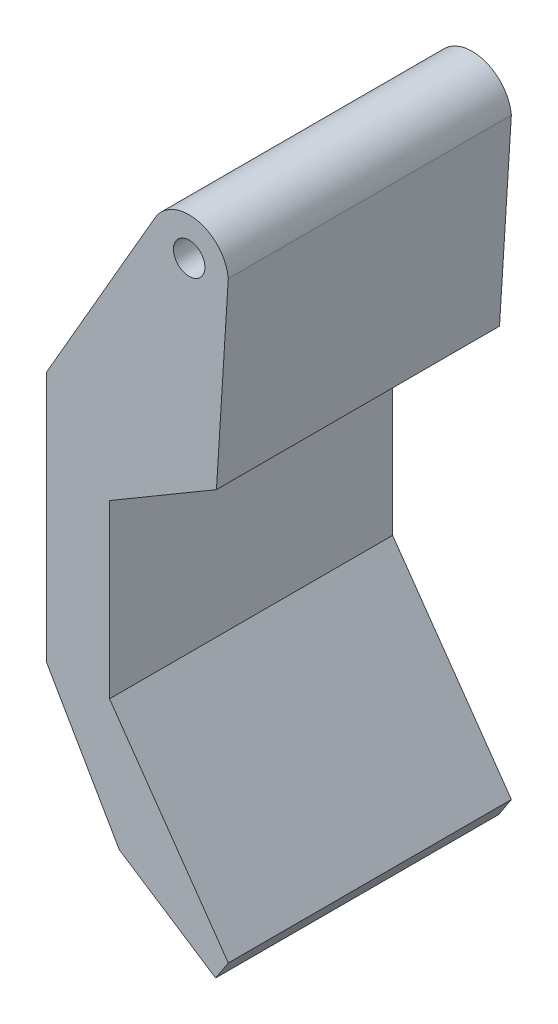
ISO-10303-21;
HEADER;
FILE_DESCRIPTION(('STEP AP214'),'2;1');
FILE_NAME('part.step','',(''),(''),'','','');
FILE_SCHEMA(('AUTOMOTIVE_DESIGN { 1 0 10303 214 1 1 1 1 }'));
ENDSEC;
DATA;
#1=APPLICATION_CONTEXT('core data for automotive mechanical design processes');
#2=APPLICATION_PROTOCOL_DEFINITION('international standard','automotive_design',2000,#1);
#3=PRODUCT_CONTEXT('',#1,'mechanical');
#4=PRODUCT('Part','Part','',(#3));
#5=PRODUCT_RELATED_PRODUCT_CATEGORY('part','',(#4));
#6=PRODUCT_DEFINITION_FORMATION('','',#4);
#7=PRODUCT_DEFINITION_CONTEXT('part definition',#1,'design');
#8=PRODUCT_DEFINITION('design','',#6,#7);
#9=PRODUCT_DEFINITION_SHAPE('','',#8);
#10=(LENGTH_UNIT() NAMED_UNIT(*) SI_UNIT(.MILLI.,.METRE.));
#11=(NAMED_UNIT(*) PLANE_ANGLE_UNIT() SI_UNIT($,.RADIAN.));
#12=(NAMED_UNIT(*) SI_UNIT($,.STERADIAN.) SOLID_ANGLE_UNIT());
#13=UNCERTAINTY_MEASURE_WITH_UNIT(LENGTH_MEASURE(1.E-05),#10,'distance_accuracy_value','');
#14=(GEOMETRIC_REPRESENTATION_CONTEXT(3) GLOBAL_UNCERTAINTY_ASSIGNED_CONTEXT((#13)) GLOBAL_UNIT_ASSIGNED_CONTEXT((#10,
#11,#12)) REPRESENTATION_CONTEXT('',''));
#15=CARTESIAN_POINT('',(0.,0.,0.));
#16=DIRECTION('',(0.,0.,1.));
#17=DIRECTION('',(1.,0.,0.));
#18=AXIS2_PLACEMENT_3D('',#15,#16,#17);
#19=CARTESIAN_POINT('',(5.76690652211303,63.6033246271349,45.));
#20=DIRECTION('',(0.,0.,-1.));
#21=DIRECTION('',(-1.,0.,0.));
#22=AXIS2_PLACEMENT_3D('',#19,#20,#21);
#23=CYLINDRICAL_SURFACE('',#22,6.26046499619758);
#24=CARTESIAN_POINT('',(5.76690652211303,63.6033246271349,0.));
#25=DIRECTION('',(0.,0.,1.));
#26=DIRECTION('',(1.,0.,0.));
#27=AXIS2_PLACEMENT_3D('',#24,#25,#26);
#28=CIRCLE('',#27,6.26046499619758);
#29=CARTESIAN_POINT('',(0.441332655320446,66.8944771544346,0.));
#30=VERTEX_POINT('',#29);
#31=CARTESIAN_POINT('',(11.9997557720586,64.1907020152488,0.));
#32=VERTEX_POINT('',#31);
#33=EDGE_CURVE('E143',#30,#32,#28,.F.);
#34=ORIENTED_EDGE('',*,*,#33,.F.);
#35=DIRECTION('',(0.,0.,-1.));
#36=VECTOR('',#35,1.);
#37=CARTESIAN_POINT('',(0.441332655320446,66.8944771544346,45.));
#38=LINE('',#37,#36);
#39=CARTESIAN_POINT('',(0.441332655320446,66.8944771544346,45.));
#40=VERTEX_POINT('',#39);
#41=EDGE_CURVE('E11',#40,#30,#38,.T.);
#42=ORIENTED_EDGE('',*,*,#41,.F.);
#43=CARTESIAN_POINT('',(5.76690652211303,63.6033246271349,45.));
#44=DIRECTION('',(0.,0.,1.));
#45=DIRECTION('',(1.,0.,0.));
#46=AXIS2_PLACEMENT_3D('',#43,#44,#45);
#47=CIRCLE('',#46,6.26046499619758);
#48=CARTESIAN_POINT('',(11.9997557720586,64.1907020152488,45.));
#49=VERTEX_POINT('',#48);
#50=EDGE_CURVE('E167',#40,#49,#47,.F.);
#51=ORIENTED_EDGE('',*,*,#50,.T.);
#52=DIRECTION('',(0.,0.,-1.));
#53=VECTOR('',#52,1.);
#54=CARTESIAN_POINT('',(11.9997557720586,64.1907020152488,45.));
#55=LINE('',#54,#53);
#56=EDGE_CURVE('E53',#49,#32,#55,.T.);
#57=ORIENTED_EDGE('',*,*,#56,.T.);
#58=EDGE_LOOP('',(#34,#42,#51,#57));
#59=FACE_BOUND('',#58,.T.);
#60=ADVANCED_FACE('F37',(#59),#23,.T.);
#61=CARTESIAN_POINT('',(-28.6351588028188,16.5325166430951,45.));
#62=DIRECTION('',(0.866025403784438,-0.500000000000001,0.));
#63=DIRECTION('',(0.500000000000001,0.866025403784438,0.));
#64=AXIS2_PLACEMENT_3D('',#61,#62,#63);
#65=PLANE('',#64);
#66=DIRECTION('',(-0.500000000000001,-0.866025403784438,0.));
#67=VECTOR('',#66,1.);
#68=CARTESIAN_POINT('',(-28.6351588028188,16.5325166430951,0.));
#69=LINE('',#68,#67);
#70=CARTESIAN_POINT('',(-16.8791754203684,36.8944771544346,0.));
#71=VERTEX_POINT('',#70);
#72=EDGE_CURVE('E145',#30,#71,#69,.T.);
#73=ORIENTED_EDGE('',*,*,#72,.T.);
#74=DIRECTION('',(0.,0.,-1.));
#75=VECTOR('',#74,1.);
#76=CARTESIAN_POINT('',(-16.8791754203684,36.8944771544346,45.));
#77=LINE('',#76,#75);
#78=CARTESIAN_POINT('',(-16.8791754203684,36.8944771544346,45.));
#79=VERTEX_POINT('',#78);
#80=EDGE_CURVE('E45',#79,#71,#77,.T.);
#81=ORIENTED_EDGE('',*,*,#80,.F.);
#82=DIRECTION('',(-0.500000000000001,-0.866025403784438,0.));
#83=VECTOR('',#82,1.);
#84=CARTESIAN_POINT('',(-28.6351588028188,16.5325166430951,45.));
#85=LINE('',#84,#83);
#86=EDGE_CURVE('E296',#40,#79,#85,.T.);
#87=ORIENTED_EDGE('',*,*,#86,.F.);
#88=ORIENTED_EDGE('',*,*,#41,.T.);
#89=EDGE_LOOP('',(#73,#81,#87,#88));
#90=FACE_BOUND('',#89,.T.);
#91=ADVANCED_FACE('F226',(#90),#65,.F.);
#92=CARTESIAN_POINT('',(-16.8791754203684,0.,45.));
#93=DIRECTION('',(1.,0.,0.));
#94=DIRECTION('',(0.,1.,0.));
#95=AXIS2_PLACEMENT_3D('',#92,#93,#94);
#96=PLANE('',#95);
#97=DIRECTION('',(0.,-1.,0.));
#98=VECTOR('',#97,1.);
#99=CARTESIAN_POINT('',(-16.8791754203684,0.,0.));
#100=LINE('',#99,#98);
#101=CARTESIAN_POINT('',(-16.8791754203684,-3.10552284556541,0.));
#102=VERTEX_POINT('',#101);
#103=EDGE_CURVE('E148',#71,#102,#100,.T.);
#104=ORIENTED_EDGE('',*,*,#103,.T.);
#105=DIRECTION('',(0.,0.,-1.));
#106=VECTOR('',#105,1.);
#107=CARTESIAN_POINT('',(-16.8791754203684,-3.10552284556541,45.));
#108=LINE('',#107,#106);
#109=CARTESIAN_POINT('',(-16.8791754203684,-3.10552284556541,45.));
#110=VERTEX_POINT('',#109);
#111=EDGE_CURVE('E178',#110,#102,#108,.T.);
#112=ORIENTED_EDGE('',*,*,#111,.F.);
#113=DIRECTION('',(0.,-1.,0.));
#114=VECTOR('',#113,1.);
#115=CARTESIAN_POINT('',(-16.8791754203684,0.,45.));
#116=LINE('',#115,#114);
#117=EDGE_CURVE('E187',#79,#110,#116,.T.);
#118=ORIENTED_EDGE('',*,*,#117,.F.);
#119=ORIENTED_EDGE('',*,*,#80,.T.);
#120=EDGE_LOOP('',(#104,#112,#118,#119));
#121=FACE_BOUND('',#120,.T.);
#122=ADVANCED_FACE('F185',(#121),#96,.F.);
#123=CARTESIAN_POINT('',(-14.0041124034225,-8.08527806587781,45.));
#124=DIRECTION('',(0.866025403784438,0.500000000000001,0.));
#125=DIRECTION('',(-0.500000000000001,0.866025403784438,0.));
#126=AXIS2_PLACEMENT_3D('',#123,#124,#125);
#127=PLANE('',#126);
#128=DIRECTION('',(0.500000000000001,-0.866025403784438,0.));
#129=VECTOR('',#128,1.);
#130=CARTESIAN_POINT('',(-14.0041124034225,-8.08527806587781,0.));
#131=LINE('',#130,#129);
#132=CARTESIAN_POINT('',(-5.3321700365758,-23.1055228455654,0.));
#133=VERTEX_POINT('',#132);
#134=EDGE_CURVE('E150',#102,#133,#131,.T.);
#135=ORIENTED_EDGE('',*,*,#134,.T.);
#136=DIRECTION('',(0.,0.,-1.));
#137=VECTOR('',#136,1.);
#138=CARTESIAN_POINT('',(-5.3321700365758,-23.1055228455654,45.));
#139=LINE('',#138,#137);
#140=CARTESIAN_POINT('',(-5.3321700365758,-23.1055228455654,45.));
#141=VERTEX_POINT('',#140);
#142=EDGE_CURVE('E175',#141,#133,#139,.T.);
#143=ORIENTED_EDGE('',*,*,#142,.F.);
#144=DIRECTION('',(0.500000000000001,-0.866025403784438,0.));
#145=VECTOR('',#144,1.);
#146=CARTESIAN_POINT('',(-14.0041124034225,-8.08527806587781,45.));
#147=LINE('',#146,#145);
#148=EDGE_CURVE('E205',#110,#141,#147,.T.);
#149=ORIENTED_EDGE('',*,*,#148,.F.);
#150=ORIENTED_EDGE('',*,*,#111,.T.);
#151=EDGE_LOOP('',(#135,#143,#149,#150));
#152=FACE_BOUND('',#151,.T.);
#153=ADVANCED_FACE('F196',(#152),#127,.F.);
#154=CARTESIAN_POINT('',(-12.166888121993,-18.6456484373278,45.));
#155=DIRECTION('',(0.546478346859033,0.837473233252394,0.));
#156=DIRECTION('',(-0.837473233252394,0.546478346859033,0.));
#157=AXIS2_PLACEMENT_3D('',#154,#155,#156);
#158=PLANE('',#157);
#159=DIRECTION('',(0.837473233252394,-0.546478346859033,0.));
#160=VECTOR('',#159,1.);
#161=CARTESIAN_POINT('',(-12.166888121993,-18.6456484373278,0.));
#162=LINE('',#161,#160);
#163=CARTESIAN_POINT('',(9.99274151876576,-33.1055228455654,0.));
#164=VERTEX_POINT('',#163);
#165=EDGE_CURVE('E152',#133,#164,#162,.T.);
#166=ORIENTED_EDGE('',*,*,#165,.T.);
#167=DIRECTION('',(0.,0.,-1.));
#168=VECTOR('',#167,1.);
#169=CARTESIAN_POINT('',(9.99274151876576,-33.1055228455654,45.));
#170=LINE('',#169,#168);
#171=CARTESIAN_POINT('',(9.99274151876576,-33.1055228455654,45.));
#172=VERTEX_POINT('',#171);
#173=EDGE_CURVE('E173',#172,#164,#170,.T.);
#174=ORIENTED_EDGE('',*,*,#173,.F.);
#175=DIRECTION('',(0.837473233252394,-0.546478346859033,0.));
#176=VECTOR('',#175,1.);
#177=CARTESIAN_POINT('',(-12.166888121993,-18.6456484373278,45.));
#178=LINE('',#177,#176);
#179=EDGE_CURVE('E202',#141,#172,#178,.T.);
#180=ORIENTED_EDGE('',*,*,#179,.F.);
#181=ORIENTED_EDGE('',*,*,#142,.T.);
#182=EDGE_LOOP('',(#166,#174,#180,#181));
#183=FACE_BOUND('',#182,.T.);
#184=ADVANCED_FACE('F200',(#183),#158,.F.);
#185=CARTESIAN_POINT('',(22.1596296407588,-14.4598744082376,45.));
#186=DIRECTION('',(0.837473233252394,-0.546478346859033,0.));
#187=DIRECTION('',(0.546478346859033,0.837473233252394,0.));
#188=AXIS2_PLACEMENT_3D('',#185,#186,#187);
#189=PLANE('',#188);
#190=DIRECTION('',(-0.546478346859033,-0.837473233252394,0.));
#191=VECTOR('',#190,1.);
#192=CARTESIAN_POINT('',(22.1596296407588,-14.4598744082376,0.));
#193=LINE('',#192,#191);
#194=CARTESIAN_POINT('',(11.9997557720586,-30.0297912533631,0.));
#195=VERTEX_POINT('',#194);
#196=EDGE_CURVE('E155',#195,#164,#193,.T.);
#197=ORIENTED_EDGE('',*,*,#196,.F.);
#198=DIRECTION('',(0.,0.,-1.));
#199=VECTOR('',#198,1.);
#200=CARTESIAN_POINT('',(11.9997557720586,-30.0297912533631,45.));
#201=LINE('',#200,#199);
#202=CARTESIAN_POINT('',(11.9997557720586,-30.0297912533631,45.));
#203=VERTEX_POINT('',#202);
#204=EDGE_CURVE('E171',#203,#195,#201,.T.);
#205=ORIENTED_EDGE('',*,*,#204,.F.);
#206=DIRECTION('',(-0.546478346859033,-0.837473233252394,0.));
#207=VECTOR('',#206,1.);
#208=CARTESIAN_POINT('',(22.1596296407588,-14.4598744082376,45.));
#209=LINE('',#208,#207);
#210=EDGE_CURVE('E204',#203,#172,#209,.T.);
#211=ORIENTED_EDGE('',*,*,#210,.T.);
#212=ORIENTED_EDGE('',*,*,#173,.T.);
#213=EDGE_LOOP('',(#197,#205,#211,#212));
#214=FACE_BOUND('',#213,.T.);
#215=ADVANCED_FACE('F239',(#214),#189,.T.);
#216=CARTESIAN_POINT('',(-6.07156547642134,-4.25729921881468,45.));
#217=DIRECTION('',(0.818775295962723,0.574114112978556,0.));
#218=DIRECTION('',(-0.574114112978556,0.818775295962724,0.));
#219=AXIS2_PLACEMENT_3D('',#216,#217,#218);
#220=PLANE('',#219);
#221=DIRECTION('',(0.574114112978556,-0.818775295962724,0.));
#222=VECTOR('',#221,1.);
#223=CARTESIAN_POINT('',(-6.07156547642134,-4.25729921881468,0.));
#224=LINE('',#223,#222);
#225=CARTESIAN_POINT('',(-6.87917542036836,-3.10552284556541,0.));
#226=VERTEX_POINT('',#225);
#227=EDGE_CURVE('E158',#226,#195,#224,.T.);
#228=ORIENTED_EDGE('',*,*,#227,.F.);
#229=DIRECTION('',(0.,0.,-1.));
#230=VECTOR('',#229,1.);
#231=CARTESIAN_POINT('',(-6.87917542036836,-3.10552284556541,45.));
#232=LINE('',#231,#230);
#233=CARTESIAN_POINT('',(-6.87917542036836,-3.10552284556541,45.));
#234=VERTEX_POINT('',#233);
#235=EDGE_CURVE('E124',#234,#226,#232,.T.);
#236=ORIENTED_EDGE('',*,*,#235,.F.);
#237=DIRECTION('',(0.574114112978556,-0.818775295962724,0.));
#238=VECTOR('',#237,1.);
#239=CARTESIAN_POINT('',(-6.07156547642134,-4.25729921881468,45.));
#240=LINE('',#239,#238);
#241=EDGE_CURVE('E135',#234,#203,#240,.T.);
#242=ORIENTED_EDGE('',*,*,#241,.T.);
#243=ORIENTED_EDGE('',*,*,#204,.T.);
#244=EDGE_LOOP('',(#228,#236,#242,#243));
#245=FACE_BOUND('',#244,.T.);
#246=ADVANCED_FACE('F212',(#245),#220,.T.);
#247=CARTESIAN_POINT('',(-6.87917542036836,0.,45.));
#248=DIRECTION('',(1.,0.,0.));
#249=DIRECTION('',(0.,1.,0.));
#250=AXIS2_PLACEMENT_3D('',#247,#248,#249);
#251=PLANE('',#250);
#252=DIRECTION('',(0.,-1.,0.));
#253=VECTOR('',#252,1.);
#254=CARTESIAN_POINT('',(-6.87917542036836,0.,0.));
#255=LINE('',#254,#253);
#256=CARTESIAN_POINT('',(-6.87917542036836,24.1907020152488,0.));
#257=VERTEX_POINT('',#256);
#258=EDGE_CURVE('E120',#257,#226,#255,.T.);
#259=ORIENTED_EDGE('',*,*,#258,.F.);
#260=DIRECTION('',(0.,0.,-1.));
#261=VECTOR('',#260,1.);
#262=CARTESIAN_POINT('',(-6.87917542036836,24.1907020152488,45.));
#263=LINE('',#262,#261);
#264=CARTESIAN_POINT('',(-6.87917542036836,24.1907020152488,45.));
#265=VERTEX_POINT('',#264);
#266=EDGE_CURVE('E115',#265,#257,#263,.T.);
#267=ORIENTED_EDGE('',*,*,#266,.F.);
#268=DIRECTION('',(0.,-1.,0.));
#269=VECTOR('',#268,1.);
#270=CARTESIAN_POINT('',(-6.87917542036836,0.,45.));
#271=LINE('',#270,#269);
#272=EDGE_CURVE('E118',#265,#234,#271,.T.);
#273=ORIENTED_EDGE('',*,*,#272,.T.);
#274=ORIENTED_EDGE('',*,*,#235,.T.);
#275=EDGE_LOOP('',(#259,#267,#273,#274));
#276=FACE_BOUND('',#275,.T.);
#277=ADVANCED_FACE('F117',(#276),#251,.T.);
#278=CARTESIAN_POINT('',(-12.343162824505,20.9753639466543,45.));
#279=DIRECTION('',(0.507164002195062,-0.861849566268666,0.));
#280=DIRECTION('',(0.861849566268666,0.507164002195062,0.));
#281=AXIS2_PLACEMENT_3D('',#278,#279,#280);
#282=PLANE('',#281);
#283=DIRECTION('',(-0.861849566268666,-0.507164002195062,0.));
#284=VECTOR('',#283,1.);
#285=CARTESIAN_POINT('',(-12.343162824505,20.9753639466543,0.));
#286=LINE('',#285,#284);
#287=CARTESIAN_POINT('',(10.1143328439896,34.1907020152488,0.));
#288=VERTEX_POINT('',#287);
#289=EDGE_CURVE('E162',#288,#257,#286,.T.);
#290=ORIENTED_EDGE('',*,*,#289,.F.);
#291=DIRECTION('',(0.,0.,-1.));
#292=VECTOR('',#291,1.);
#293=CARTESIAN_POINT('',(10.1143328439896,34.1907020152488,45.));
#294=LINE('',#293,#292);
#295=CARTESIAN_POINT('',(10.1143328439896,34.1907020152488,45.));
#296=VERTEX_POINT('',#295);
#297=EDGE_CURVE('E84',#296,#288,#294,.T.);
#298=ORIENTED_EDGE('',*,*,#297,.F.);
#299=DIRECTION('',(-0.861849566268666,-0.507164002195062,0.));
#300=VECTOR('',#299,1.);
#301=CARTESIAN_POINT('',(-12.343162824505,20.9753639466543,45.));
#302=LINE('',#301,#300);
#303=EDGE_CURVE('E132',#296,#265,#302,.T.);
#304=ORIENTED_EDGE('',*,*,#303,.T.);
#305=ORIENTED_EDGE('',*,*,#266,.T.);
#306=EDGE_LOOP('',(#290,#298,#304,#305));
#307=FACE_BOUND('',#306,.T.);
#308=ADVANCED_FACE('F137',(#307),#282,.T.);
#309=CARTESIAN_POINT('',(7.93419657418711,-0.498643871225965,45.));
#310=DIRECTION('',(0.998030931366063,-0.0627236800306547,0.));
#311=DIRECTION('',(0.0627236800306548,0.998030931366064,0.));
#312=AXIS2_PLACEMENT_3D('',#309,#310,#311);
#313=PLANE('',#312);
#314=DIRECTION('',(-0.0627236800306548,-0.998030931366063,0.));
#315=VECTOR('',#314,1.);
#316=CARTESIAN_POINT('',(7.93419657418711,-0.498643871225965,0.));
#317=LINE('',#316,#315);
#318=EDGE_CURVE('E164',#32,#288,#317,.T.);
#319=ORIENTED_EDGE('',*,*,#318,.F.);
#320=ORIENTED_EDGE('',*,*,#56,.F.);
#321=DIRECTION('',(-0.0627236800306548,-0.998030931366063,0.));
#322=VECTOR('',#321,1.);
#323=CARTESIAN_POINT('',(7.93419657418711,-0.498643871225965,45.));
#324=LINE('',#323,#322);
#325=EDGE_CURVE('E138',#49,#296,#324,.T.);
#326=ORIENTED_EDGE('',*,*,#325,.T.);
#327=ORIENTED_EDGE('',*,*,#297,.T.);
#328=EDGE_LOOP('',(#319,#320,#326,#327));
#329=FACE_BOUND('',#328,.T.);
#330=ADVANCED_FACE('F214',(#329),#313,.T.);
#331=CARTESIAN_POINT('',(0.,0.,45.));
#332=DIRECTION('',(0.,0.,1.));
#333=DIRECTION('',(1.,0.,0.));
#334=AXIS2_PLACEMENT_3D('',#331,#332,#333);
#335=PLANE('',#334);
#336=CARTESIAN_POINT('',(5.7844226517787,63.8812301614218,45.));
#337=DIRECTION('',(0.,0.,1.));
#338=DIRECTION('',(1.,0.,0.));
#339=AXIS2_PLACEMENT_3D('',#336,#337,#338);
#340=CIRCLE('',#339,2.5);
#341=CARTESIAN_POINT('',(3.2844226517787,63.8812301614218,45.));
#342=VERTEX_POINT('',#341);
#343=EDGE_CURVE('E146',#342,#342,#340,.T.);
#344=ORIENTED_EDGE('',*,*,#343,.F.);
#345=EDGE_LOOP('',(#344));
#346=FACE_BOUND('',#345,.T.);
#347=ORIENTED_EDGE('',*,*,#50,.F.);
#348=ORIENTED_EDGE('',*,*,#86,.T.);
#349=ORIENTED_EDGE('',*,*,#117,.T.);
#350=ORIENTED_EDGE('',*,*,#148,.T.);
#351=ORIENTED_EDGE('',*,*,#179,.T.);
#352=ORIENTED_EDGE('',*,*,#210,.F.);
#353=ORIENTED_EDGE('',*,*,#241,.F.);
#354=ORIENTED_EDGE('',*,*,#272,.F.);
#355=ORIENTED_EDGE('',*,*,#303,.F.);
#356=ORIENTED_EDGE('',*,*,#325,.F.);
#357=EDGE_LOOP('',(#347,#348,#349,#350,#351,#352,#353,#354,#355,#356));
#358=FACE_BOUND('',#357,.T.);
#359=ADVANCED_FACE('F130',(#346,#358),#335,.T.);
#360=CARTESIAN_POINT('',(0.,0.,0.));
#361=DIRECTION('',(0.,0.,1.));
#362=DIRECTION('',(1.,0.,0.));
#363=AXIS2_PLACEMENT_3D('',#360,#361,#362);
#364=PLANE('',#363);
#365=CARTESIAN_POINT('',(5.7844226517787,63.8812301614218,0.));
#366=DIRECTION('',(0.,0.,1.));
#367=DIRECTION('',(1.,0.,0.));
#368=AXIS2_PLACEMENT_3D('',#365,#366,#367);
#369=CIRCLE('',#368,2.5);
#370=CARTESIAN_POINT('',(3.2844226517787,63.8812301614218,0.));
#371=VERTEX_POINT('',#370);
#372=EDGE_CURVE('E291',#371,#371,#369,.T.);
#373=ORIENTED_EDGE('',*,*,#372,.T.);
#374=EDGE_LOOP('',(#373));
#375=FACE_BOUND('',#374,.T.);
#376=ORIENTED_EDGE('',*,*,#33,.T.);
#377=ORIENTED_EDGE('',*,*,#318,.T.);
#378=ORIENTED_EDGE('',*,*,#289,.T.);
#379=ORIENTED_EDGE('',*,*,#258,.T.);
#380=ORIENTED_EDGE('',*,*,#227,.T.);
#381=ORIENTED_EDGE('',*,*,#196,.T.);
#382=ORIENTED_EDGE('',*,*,#165,.F.);
#383=ORIENTED_EDGE('',*,*,#134,.F.);
#384=ORIENTED_EDGE('',*,*,#103,.F.);
#385=ORIENTED_EDGE('',*,*,#72,.F.);
#386=EDGE_LOOP('',(#376,#377,#378,#379,#380,#381,#382,#383,#384,#385));
#387=FACE_BOUND('',#386,.T.);
#388=ADVANCED_FACE('F192',(#375,#387),#364,.F.);
#389=CARTESIAN_POINT('',(5.7844226517787,63.8812301614218,45.));
#390=DIRECTION('',(0.,0.,-1.));
#391=DIRECTION('',(-1.,0.,0.));
#392=AXIS2_PLACEMENT_3D('',#389,#390,#391);
#393=CYLINDRICAL_SURFACE('',#392,2.5);
#394=CARTESIAN_POINT('',(3.2844226517787,63.8812301614218,45.));
#395=CARTESIAN_POINT('',(3.2844226517787,63.8812301614218,44.53125));
#396=CARTESIAN_POINT('',(3.2844226517787,63.8812301614218,44.0625));
#397=CARTESIAN_POINT('',(3.2844226517787,63.8812301614218,43.125));
#398=CARTESIAN_POINT('',(3.2844226517787,63.8812301614218,42.65625));
#399=CARTESIAN_POINT('',(3.2844226517787,63.8812301614218,41.71875));
#400=CARTESIAN_POINT('',(3.2844226517787,63.8812301614218,41.25));
#401=CARTESIAN_POINT('',(3.2844226517787,63.8812301614218,40.3125));
#402=CARTESIAN_POINT('',(3.2844226517787,63.8812301614218,39.84375));
#403=CARTESIAN_POINT('',(3.2844226517787,63.8812301614218,38.90625));
#404=CARTESIAN_POINT('',(3.2844226517787,63.8812301614218,38.4375));
#405=CARTESIAN_POINT('',(3.2844226517787,63.8812301614218,37.5));
#406=CARTESIAN_POINT('',(3.2844226517787,63.8812301614218,37.03125));
#407=CARTESIAN_POINT('',(3.2844226517787,63.8812301614218,36.09375));
#408=CARTESIAN_POINT('',(3.2844226517787,63.8812301614218,35.625));
#409=CARTESIAN_POINT('',(3.2844226517787,63.8812301614218,34.6875));
#410=CARTESIAN_POINT('',(3.2844226517787,63.8812301614218,34.21875));
#411=CARTESIAN_POINT('',(3.2844226517787,63.8812301614218,33.28125));
#412=CARTESIAN_POINT('',(3.2844226517787,63.8812301614218,32.8125));
#413=CARTESIAN_POINT('',(3.2844226517787,63.8812301614218,31.875));
#414=CARTESIAN_POINT('',(3.2844226517787,63.8812301614218,31.40625));
#415=CARTESIAN_POINT('',(3.2844226517787,63.8812301614218,30.46875));
#416=CARTESIAN_POINT('',(3.2844226517787,63.8812301614218,30.));
#417=CARTESIAN_POINT('',(3.2844226517787,63.8812301614218,29.0625));
#418=CARTESIAN_POINT('',(3.2844226517787,63.8812301614218,28.59375));
#419=CARTESIAN_POINT('',(3.2844226517787,63.8812301614218,27.65625));
#420=CARTESIAN_POINT('',(3.2844226517787,63.8812301614218,27.1875));
#421=CARTESIAN_POINT('',(3.2844226517787,63.8812301614218,26.25));
#422=CARTESIAN_POINT('',(3.2844226517787,63.8812301614218,25.78125));
#423=CARTESIAN_POINT('',(3.2844226517787,63.8812301614218,24.84375));
#424=CARTESIAN_POINT('',(3.2844226517787,63.8812301614218,24.375));
#425=CARTESIAN_POINT('',(3.2844226517787,63.8812301614218,23.4375));
#426=CARTESIAN_POINT('',(3.2844226517787,63.8812301614218,22.96875));
#427=CARTESIAN_POINT('',(3.2844226517787,63.8812301614218,22.03125));
#428=CARTESIAN_POINT('',(3.2844226517787,63.8812301614218,21.5625));
#429=CARTESIAN_POINT('',(3.2844226517787,63.8812301614218,20.625));
#430=CARTESIAN_POINT('',(3.2844226517787,63.8812301614218,20.15625));
#431=CARTESIAN_POINT('',(3.2844226517787,63.8812301614218,19.21875));
#432=CARTESIAN_POINT('',(3.2844226517787,63.8812301614218,18.75));
#433=CARTESIAN_POINT('',(3.2844226517787,63.8812301614218,17.8125));
#434=CARTESIAN_POINT('',(3.2844226517787,63.8812301614218,17.34375));
#435=CARTESIAN_POINT('',(3.2844226517787,63.8812301614218,16.40625));
#436=CARTESIAN_POINT('',(3.2844226517787,63.8812301614218,15.9375));
#437=CARTESIAN_POINT('',(3.2844226517787,63.8812301614218,15.));
#438=CARTESIAN_POINT('',(3.2844226517787,63.8812301614218,14.53125));
#439=CARTESIAN_POINT('',(3.2844226517787,63.8812301614218,13.59375));
#440=CARTESIAN_POINT('',(3.2844226517787,63.8812301614218,13.125));
#441=CARTESIAN_POINT('',(3.2844226517787,63.8812301614218,12.1875));
#442=CARTESIAN_POINT('',(3.2844226517787,63.8812301614218,11.71875));
#443=CARTESIAN_POINT('',(3.2844226517787,63.8812301614218,10.78125));
#444=CARTESIAN_POINT('',(3.2844226517787,63.8812301614218,10.3125));
#445=CARTESIAN_POINT('',(3.2844226517787,63.8812301614218,9.37499999999999));
#446=CARTESIAN_POINT('',(3.2844226517787,63.8812301614218,8.90624999999999));
#447=CARTESIAN_POINT('',(3.2844226517787,63.8812301614218,7.96874999999999));
#448=CARTESIAN_POINT('',(3.2844226517787,63.8812301614218,7.5));
#449=CARTESIAN_POINT('',(3.2844226517787,63.8812301614218,6.56249999999999));
#450=CARTESIAN_POINT('',(3.2844226517787,63.8812301614218,6.09374999999999));
#451=CARTESIAN_POINT('',(3.2844226517787,63.8812301614218,5.15624999999999));
#452=CARTESIAN_POINT('',(3.2844226517787,63.8812301614218,4.68749999999999));
#453=CARTESIAN_POINT('',(3.2844226517787,63.8812301614218,3.74999999999999));
#454=CARTESIAN_POINT('',(3.2844226517787,63.8812301614218,3.28124999999999));
#455=CARTESIAN_POINT('',(3.2844226517787,63.8812301614218,2.34374999999999));
#456=CARTESIAN_POINT('',(3.2844226517787,63.8812301614218,1.87499999999999));
#457=CARTESIAN_POINT('',(3.2844226517787,63.8812301614218,0.937499999999992));
#458=CARTESIAN_POINT('',(3.2844226517787,63.8812301614218,0.468749999999993));
#459=CARTESIAN_POINT('',(3.2844226517787,63.8812301614218,0.));
#460=B_SPLINE_CURVE_WITH_KNOTS('',3,(#394,#395,#396,#397,#398,#399,#400,#401,#402,#403,#404,
#405,#406,#407,#408,#409,#410,#411,#412,#413,#414,#415,#416,#417,#418,#419,#420,#421,#422,#423,
#424,#425,#426,#427,#428,#429,#430,#431,#432,#433,#434,#435,#436,#437,#438,#439,#440,#441,#442,
#443,#444,#445,#446,#447,#448,#449,#450,#451,#452,#453,#454,#455,#456,#457,#458,#459),
.UNSPECIFIED.,.F.,.F.,(4,2,2,2,2,2,2,2,2,2,2,2,2,2,2,2,2,2,2,2,2,2,2,2,2,2,2,2,2,2,2,2,4),(0.,
1.40625,2.8125,4.21874999999999,5.625,7.03125,8.43749999999999,9.84375,11.25,12.65625,14.0625,
15.46875,16.875,18.28125,19.6875,21.09375,22.5,23.90625,25.3125,26.71875,28.125,29.53125,
30.9375,32.34375,33.75,35.15625,36.5625,37.96875,39.375,40.78125,42.1875,43.59375,45.),.UNSPECIFIED.);
#461=EDGE_CURVE('BSEAM273',#342,#371,#460,.T.);
#462=ORIENTED_EDGE('',*,*,#343,.T.);
#463=ORIENTED_EDGE('',*,*,#372,.F.);
#464=ORIENTED_EDGE('',*,*,#461,.T.);
#465=ORIENTED_EDGE('',*,*,#461,.F.);
#466=EDGE_LOOP('',(#462,#464,#463,#465));
#467=FACE_BOUND('',#466,.T.);
#468=ADVANCED_FACE('F273',(#467),#393,.F.);
#469=CLOSED_SHELL('',(#60,#91,#122,#153,#184,#215,#246,#277,#308,#330,#359,#388,#468));
#470=MANIFOLD_SOLID_BREP('B2',#469);
#471=ADVANCED_BREP_SHAPE_REPRESENTATION('',(#18,#470),#14);
#472=SHAPE_DEFINITION_REPRESENTATION(#9,#471);
ENDSEC;
END-ISO-10303-21;
